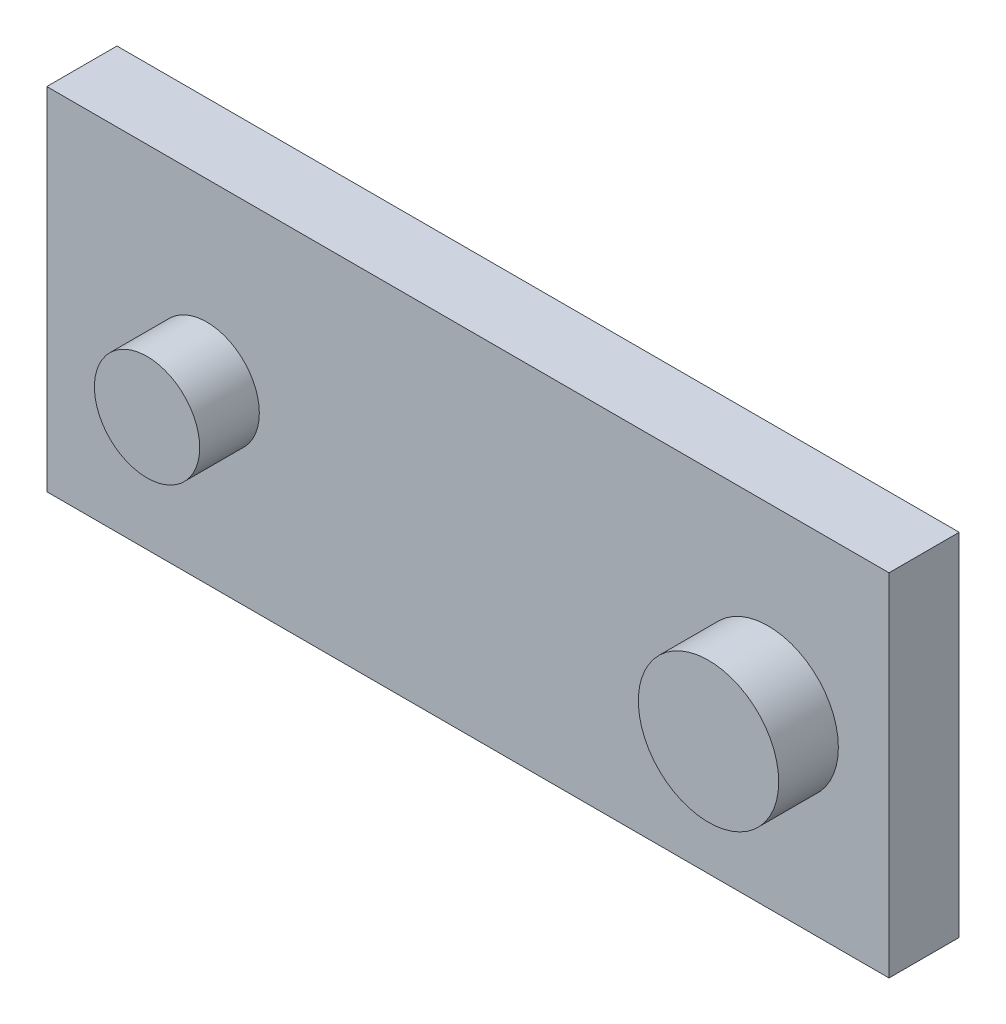
ISO-10303-21;
HEADER;
FILE_DESCRIPTION(('STEP AP214'),'2;1');
FILE_NAME('part.step','',(''),(''),'','','');
FILE_SCHEMA(('AUTOMOTIVE_DESIGN { 1 0 10303 214 1 1 1 1 }'));
ENDSEC;
DATA;
#1=APPLICATION_CONTEXT('core data for automotive mechanical design processes');
#2=APPLICATION_PROTOCOL_DEFINITION('international standard','automotive_design',2000,#1);
#3=PRODUCT_CONTEXT('',#1,'mechanical');
#4=PRODUCT('Part','Part','',(#3));
#5=PRODUCT_RELATED_PRODUCT_CATEGORY('part','',(#4));
#6=PRODUCT_DEFINITION_FORMATION('','',#4);
#7=PRODUCT_DEFINITION_CONTEXT('part definition',#1,'design');
#8=PRODUCT_DEFINITION('design','',#6,#7);
#9=PRODUCT_DEFINITION_SHAPE('','',#8);
#10=(LENGTH_UNIT() NAMED_UNIT(*) SI_UNIT(.MILLI.,.METRE.));
#11=(NAMED_UNIT(*) PLANE_ANGLE_UNIT() SI_UNIT($,.RADIAN.));
#12=(NAMED_UNIT(*) SI_UNIT($,.STERADIAN.) SOLID_ANGLE_UNIT());
#13=UNCERTAINTY_MEASURE_WITH_UNIT(LENGTH_MEASURE(1.E-05),#10,'distance_accuracy_value','');
#14=(GEOMETRIC_REPRESENTATION_CONTEXT(3) GLOBAL_UNCERTAINTY_ASSIGNED_CONTEXT((#13)) GLOBAL_UNIT_ASSIGNED_CONTEXT((#10,
#11,#12)) REPRESENTATION_CONTEXT('',''));
#15=CARTESIAN_POINT('',(0.,0.,0.));
#16=DIRECTION('',(0.,0.,1.));
#17=DIRECTION('',(1.,0.,0.));
#18=AXIS2_PLACEMENT_3D('',#15,#16,#17);
#19=CARTESIAN_POINT('',(-25.9134939335095,39.1455119678231,5.));
#20=DIRECTION('',(1.,0.,0.));
#21=DIRECTION('',(0.,1.,0.));
#22=AXIS2_PLACEMENT_3D('',#19,#20,#21);
#23=PLANE('',#22);
#24=DIRECTION('',(0.,-1.,0.));
#25=VECTOR('',#24,1.);
#26=CARTESIAN_POINT('',(-25.9134939335095,39.1455119678231,-5.));
#27=LINE('',#26,#25);
#28=CARTESIAN_POINT('',(-25.9134939335095,39.1455119678231,-5.));
#29=VERTEX_POINT('',#28);
#30=CARTESIAN_POINT('',(-25.9134939335094,-10.8544880321769,-5.));
#31=VERTEX_POINT('',#30);
#32=EDGE_CURVE('E105',#29,#31,#27,.T.);
#33=ORIENTED_EDGE('',*,*,#32,.T.);
#34=DIRECTION('',(0.,0.,-1.));
#35=VECTOR('',#34,1.);
#36=CARTESIAN_POINT('',(-25.9134939335094,-10.8544880321769,5.));
#37=LINE('',#36,#35);
#38=CARTESIAN_POINT('',(-25.9134939335094,-10.8544880321769,5.));
#39=VERTEX_POINT('',#38);
#40=EDGE_CURVE('E11',#39,#31,#37,.T.);
#41=ORIENTED_EDGE('',*,*,#40,.F.);
#42=DIRECTION('',(0.,-1.,0.));
#43=VECTOR('',#42,1.);
#44=CARTESIAN_POINT('',(-25.9134939335095,39.1455119678231,5.));
#45=LINE('',#44,#43);
#46=CARTESIAN_POINT('',(-25.9134939335095,39.1455119678231,5.));
#47=VERTEX_POINT('',#46);
#48=EDGE_CURVE('E92',#47,#39,#45,.T.);
#49=ORIENTED_EDGE('',*,*,#48,.F.);
#50=DIRECTION('',(0.,0.,-1.));
#51=VECTOR('',#50,1.);
#52=CARTESIAN_POINT('',(-25.9134939335095,39.1455119678231,5.));
#53=LINE('',#52,#51);
#54=EDGE_CURVE('E101',#47,#29,#53,.T.);
#55=ORIENTED_EDGE('',*,*,#54,.T.);
#56=EDGE_LOOP('',(#33,#41,#49,#55));
#57=FACE_BOUND('',#56,.T.);
#58=ADVANCED_FACE('F39',(#57),#23,.F.);
#59=CARTESIAN_POINT('',(-25.9134939335094,-10.8544880321769,5.));
#60=DIRECTION('',(0.,1.,0.));
#61=DIRECTION('',(0.,0.,1.));
#62=AXIS2_PLACEMENT_3D('',#59,#60,#61);
#63=PLANE('',#62);
#64=DIRECTION('',(1.,0.,0.));
#65=VECTOR('',#64,1.);
#66=CARTESIAN_POINT('',(-25.9134939335094,-10.8544880321769,-5.));
#67=LINE('',#66,#65);
#68=CARTESIAN_POINT('',(94.0865060664905,-10.8544880321769,-5.));
#69=VERTEX_POINT('',#68);
#70=EDGE_CURVE('E96',#31,#69,#67,.T.);
#71=ORIENTED_EDGE('',*,*,#70,.T.);
#72=DIRECTION('',(0.,0.,-1.));
#73=VECTOR('',#72,1.);
#74=CARTESIAN_POINT('',(94.0865060664905,-10.8544880321769,5.));
#75=LINE('',#74,#73);
#76=CARTESIAN_POINT('',(94.0865060664905,-10.8544880321769,5.));
#77=VERTEX_POINT('',#76);
#78=EDGE_CURVE('E48',#77,#69,#75,.T.);
#79=ORIENTED_EDGE('',*,*,#78,.F.);
#80=DIRECTION('',(1.,0.,0.));
#81=VECTOR('',#80,1.);
#82=CARTESIAN_POINT('',(-25.9134939335094,-10.8544880321769,5.));
#83=LINE('',#82,#81);
#84=EDGE_CURVE('E87',#39,#77,#83,.T.);
#85=ORIENTED_EDGE('',*,*,#84,.F.);
#86=ORIENTED_EDGE('',*,*,#40,.T.);
#87=EDGE_LOOP('',(#71,#79,#85,#86));
#88=FACE_BOUND('',#87,.T.);
#89=ADVANCED_FACE('F95',(#88),#63,.F.);
#90=CARTESIAN_POINT('',(94.0865060664905,39.1455119678231,5.));
#91=DIRECTION('',(-1.,0.,0.));
#92=DIRECTION('',(0.,0.,1.));
#93=AXIS2_PLACEMENT_3D('',#90,#91,#92);
#94=PLANE('',#93);
#95=DIRECTION('',(0.,1.,0.));
#96=VECTOR('',#95,1.);
#97=CARTESIAN_POINT('',(94.0865060664905,39.1455119678231,-5.));
#98=LINE('',#97,#96);
#99=CARTESIAN_POINT('',(94.0865060664905,39.1455119678231,-5.));
#100=VERTEX_POINT('',#99);
#101=EDGE_CURVE('E74',#69,#100,#98,.T.);
#102=ORIENTED_EDGE('',*,*,#101,.T.);
#103=DIRECTION('',(0.,0.,-1.));
#104=VECTOR('',#103,1.);
#105=CARTESIAN_POINT('',(94.0865060664905,39.1455119678231,5.));
#106=LINE('',#105,#104);
#107=CARTESIAN_POINT('',(94.0865060664905,39.1455119678231,5.));
#108=VERTEX_POINT('',#107);
#109=EDGE_CURVE('E97',#108,#100,#106,.T.);
#110=ORIENTED_EDGE('',*,*,#109,.F.);
#111=DIRECTION('',(0.,1.,0.));
#112=VECTOR('',#111,1.);
#113=CARTESIAN_POINT('',(94.0865060664905,39.1455119678231,5.));
#114=LINE('',#113,#112);
#115=EDGE_CURVE('E90',#77,#108,#114,.T.);
#116=ORIENTED_EDGE('',*,*,#115,.F.);
#117=ORIENTED_EDGE('',*,*,#78,.T.);
#118=EDGE_LOOP('',(#102,#110,#116,#117));
#119=FACE_BOUND('',#118,.T.);
#120=ADVANCED_FACE('F99',(#119),#94,.F.);
#121=CARTESIAN_POINT('',(-25.9134939335095,39.1455119678231,5.));
#122=DIRECTION('',(0.,-1.,0.));
#123=DIRECTION('',(0.,0.,-1.));
#124=AXIS2_PLACEMENT_3D('',#121,#122,#123);
#125=PLANE('',#124);
#126=DIRECTION('',(-1.,0.,0.));
#127=VECTOR('',#126,1.);
#128=CARTESIAN_POINT('',(-25.9134939335095,39.1455119678231,-5.));
#129=LINE('',#128,#127);
#130=EDGE_CURVE('E80',#100,#29,#129,.T.);
#131=ORIENTED_EDGE('',*,*,#130,.T.);
#132=ORIENTED_EDGE('',*,*,#54,.F.);
#133=DIRECTION('',(-1.,0.,0.));
#134=VECTOR('',#133,1.);
#135=CARTESIAN_POINT('',(-25.9134939335095,39.1455119678231,5.));
#136=LINE('',#135,#134);
#137=EDGE_CURVE('E57',#108,#47,#136,.T.);
#138=ORIENTED_EDGE('',*,*,#137,.F.);
#139=ORIENTED_EDGE('',*,*,#109,.T.);
#140=EDGE_LOOP('',(#131,#132,#138,#139));
#141=FACE_BOUND('',#140,.T.);
#142=ADVANCED_FACE('F158',(#141),#125,.F.);
#143=CARTESIAN_POINT('',(0.,0.,5.));
#144=DIRECTION('',(0.,0.,1.));
#145=DIRECTION('',(1.,0.,0.));
#146=AXIS2_PLACEMENT_3D('',#143,#144,#145);
#147=PLANE('',#146);
#148=CARTESIAN_POINT('',(76.8692934429042,13.9882561398362,5.));
#149=DIRECTION('',(0.,0.,1.));
#150=DIRECTION('',(1.,0.,0.));
#151=AXIS2_PLACEMENT_3D('',#148,#149,#150);
#152=CIRCLE('',#151,10.);
#153=CARTESIAN_POINT('',(86.8692934429042,13.9882561398362,5.));
#154=VERTEX_POINT('',#153);
#155=EDGE_CURVE('E42',#154,#154,#152,.F.);
#156=ORIENTED_EDGE('',*,*,#155,.T.);
#157=EDGE_LOOP('',(#156));
#158=FACE_BOUND('',#157,.T.);
#159=CARTESIAN_POINT('',(-3.13070655709578,13.9882561398362,5.));
#160=DIRECTION('',(0.,0.,1.));
#161=DIRECTION('',(1.,0.,0.));
#162=AXIS2_PLACEMENT_3D('',#159,#160,#161);
#163=CIRCLE('',#162,7.5);
#164=CARTESIAN_POINT('',(4.36929344290421,13.9882561398362,5.));
#165=VERTEX_POINT('',#164);
#166=EDGE_CURVE('E108',#165,#165,#163,.F.);
#167=ORIENTED_EDGE('',*,*,#166,.T.);
#168=EDGE_LOOP('',(#167));
#169=FACE_BOUND('',#168,.T.);
#170=ORIENTED_EDGE('',*,*,#48,.T.);
#171=ORIENTED_EDGE('',*,*,#84,.T.);
#172=ORIENTED_EDGE('',*,*,#115,.T.);
#173=ORIENTED_EDGE('',*,*,#137,.T.);
#174=EDGE_LOOP('',(#170,#171,#172,#173));
#175=FACE_BOUND('',#174,.T.);
#176=ADVANCED_FACE('F88',(#158,#169,#175),#147,.T.);
#177=CARTESIAN_POINT('',(0.,0.,-5.));
#178=DIRECTION('',(0.,0.,1.));
#179=DIRECTION('',(1.,0.,0.));
#180=AXIS2_PLACEMENT_3D('',#177,#178,#179);
#181=PLANE('',#180);
#182=ORIENTED_EDGE('',*,*,#32,.F.);
#183=ORIENTED_EDGE('',*,*,#130,.F.);
#184=ORIENTED_EDGE('',*,*,#101,.F.);
#185=ORIENTED_EDGE('',*,*,#70,.F.);
#186=EDGE_LOOP('',(#182,#183,#184,#185));
#187=FACE_BOUND('',#186,.T.);
#188=ADVANCED_FACE('F149',(#187),#181,.F.);
#189=CARTESIAN_POINT('',(-3.13070655709578,13.9882561398362,13.5));
#190=DIRECTION('',(0.,0.,-1.));
#191=DIRECTION('',(-1.,0.,0.));
#192=AXIS2_PLACEMENT_3D('',#189,#190,#191);
#193=CYLINDRICAL_SURFACE('',#192,7.5);
#194=ORIENTED_EDGE('',*,*,#166,.F.);
#195=EDGE_LOOP('',(#194));
#196=FACE_BOUND('',#195,.T.);
#197=CARTESIAN_POINT('',(-3.13070655709578,13.9882561398362,13.5));
#198=DIRECTION('',(0.,0.,1.));
#199=DIRECTION('',(1.,0.,0.));
#200=AXIS2_PLACEMENT_3D('',#197,#198,#199);
#201=CIRCLE('',#200,7.5);
#202=CARTESIAN_POINT('',(4.36929344290421,13.9882561398362,13.5));
#203=VERTEX_POINT('',#202);
#204=EDGE_CURVE('E114',#203,#203,#201,.T.);
#205=ORIENTED_EDGE('',*,*,#204,.F.);
#206=EDGE_LOOP('',(#205));
#207=FACE_BOUND('',#206,.T.);
#208=ADVANCED_FACE('F139',(#196,#207),#193,.T.);
#209=CARTESIAN_POINT('',(-3.13070655709578,13.9882561398362,13.5));
#210=DIRECTION('',(0.,0.,1.));
#211=DIRECTION('',(1.,0.,0.));
#212=AXIS2_PLACEMENT_3D('',#209,#210,#211);
#213=PLANE('',#212);
#214=ORIENTED_EDGE('',*,*,#204,.T.);
#215=EDGE_LOOP('',(#214));
#216=FACE_BOUND('',#215,.T.);
#217=ADVANCED_FACE('F131',(#216),#213,.T.);
#218=CARTESIAN_POINT('',(76.8692934429042,13.9882561398362,13.5));
#219=DIRECTION('',(0.,0.,-1.));
#220=DIRECTION('',(-1.,0.,0.));
#221=AXIS2_PLACEMENT_3D('',#218,#219,#220);
#222=CYLINDRICAL_SURFACE('',#221,10.);
#223=ORIENTED_EDGE('',*,*,#155,.F.);
#224=EDGE_LOOP('',(#223));
#225=FACE_BOUND('',#224,.T.);
#226=CARTESIAN_POINT('',(76.8692934429042,13.9882561398362,13.5));
#227=DIRECTION('',(0.,0.,1.));
#228=DIRECTION('',(1.,0.,0.));
#229=AXIS2_PLACEMENT_3D('',#226,#227,#228);
#230=CIRCLE('',#229,10.);
#231=CARTESIAN_POINT('',(86.8692934429042,13.9882561398362,13.5));
#232=VERTEX_POINT('',#231);
#233=EDGE_CURVE('E122',#232,#232,#230,.T.);
#234=ORIENTED_EDGE('',*,*,#233,.F.);
#235=EDGE_LOOP('',(#234));
#236=FACE_BOUND('',#235,.T.);
#237=ADVANCED_FACE('F129',(#225,#236),#222,.T.);
#238=CARTESIAN_POINT('',(76.8692934429042,13.9882561398362,13.5));
#239=DIRECTION('',(0.,0.,1.));
#240=DIRECTION('',(1.,0.,0.));
#241=AXIS2_PLACEMENT_3D('',#238,#239,#240);
#242=PLANE('',#241);
#243=ORIENTED_EDGE('',*,*,#233,.T.);
#244=EDGE_LOOP('',(#243));
#245=FACE_BOUND('',#244,.T.);
#246=ADVANCED_FACE('F127',(#245),#242,.T.);
#247=CLOSED_SHELL('',(#58,#89,#120,#142,#176,#188,#208,#217,#237,#246));
#248=MANIFOLD_SOLID_BREP('B2',#247);
#249=ADVANCED_BREP_SHAPE_REPRESENTATION('',(#18,#248),#14);
#250=SHAPE_DEFINITION_REPRESENTATION(#9,#249);
ENDSEC;
END-ISO-10303-21;
